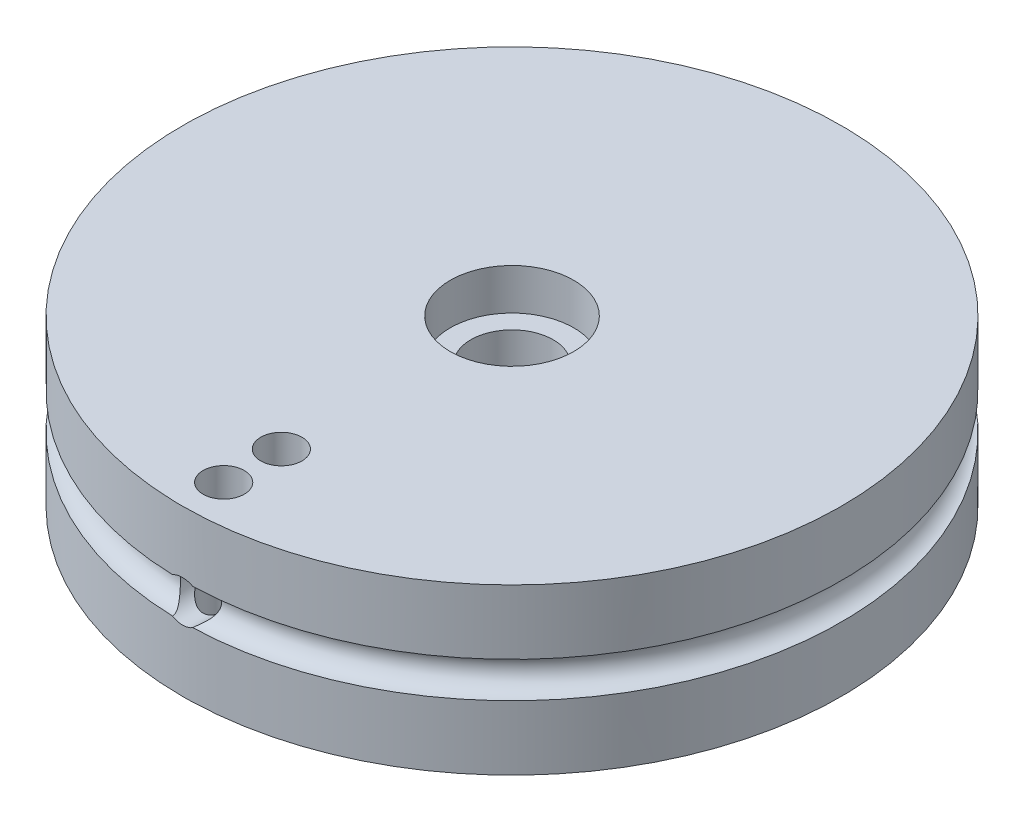
ISO-10303-21;
HEADER;
FILE_DESCRIPTION(('STEP AP214'),'2;1');
FILE_NAME('part.step','',(''),(''),'','','');
FILE_SCHEMA(('AUTOMOTIVE_DESIGN { 1 0 10303 214 1 1 1 1 }'));
ENDSEC;
DATA;
#1=APPLICATION_CONTEXT('core data for automotive mechanical design processes');
#2=APPLICATION_PROTOCOL_DEFINITION('international standard','automotive_design',2000,#1);
#3=PRODUCT_CONTEXT('',#1,'mechanical');
#4=PRODUCT('Part','Part','',(#3));
#5=PRODUCT_RELATED_PRODUCT_CATEGORY('part','',(#4));
#6=PRODUCT_DEFINITION_FORMATION('','',#4);
#7=PRODUCT_DEFINITION_CONTEXT('part definition',#1,'design');
#8=PRODUCT_DEFINITION('design','',#6,#7);
#9=PRODUCT_DEFINITION_SHAPE('','',#8);
#10=(LENGTH_UNIT() NAMED_UNIT(*) SI_UNIT(.MILLI.,.METRE.));
#11=(NAMED_UNIT(*) PLANE_ANGLE_UNIT() SI_UNIT($,.RADIAN.));
#12=(NAMED_UNIT(*) SI_UNIT($,.STERADIAN.) SOLID_ANGLE_UNIT());
#13=UNCERTAINTY_MEASURE_WITH_UNIT(LENGTH_MEASURE(1.E-05),#10,'distance_accuracy_value','');
#14=(GEOMETRIC_REPRESENTATION_CONTEXT(3) GLOBAL_UNCERTAINTY_ASSIGNED_CONTEXT((#13)) GLOBAL_UNIT_ASSIGNED_CONTEXT((#10,
#11,#12)) REPRESENTATION_CONTEXT('',''));
#15=CARTESIAN_POINT('',(0.,0.,0.));
#16=DIRECTION('',(0.,0.,1.));
#17=DIRECTION('',(1.,0.,0.));
#18=AXIS2_PLACEMENT_3D('',#15,#16,#17);
#19=CARTESIAN_POINT('',(0.,0.,7.112));
#20=DIRECTION('',(0.,1.,0.));
#21=DIRECTION('',(0.,0.,1.));
#22=AXIS2_PLACEMENT_3D('',#19,#20,#21);
#23=CYLINDRICAL_SURFACE('',#22,0.635);
#24=CARTESIAN_POINT('',(0.,0.,7.112));
#25=DIRECTION('',(0.,1.,0.));
#26=DIRECTION('',(0.,0.,1.));
#27=AXIS2_PLACEMENT_3D('',#24,#25,#26);
#28=CIRCLE('',#27,0.635);
#29=CARTESIAN_POINT('',(0.,0.,7.747));
#30=VERTEX_POINT('',#29);
#31=EDGE_CURVE('E176',#30,#30,#28,.T.);
#32=ORIENTED_EDGE('',*,*,#31,.F.);
#33=EDGE_LOOP('',(#32));
#34=FACE_BOUND('',#33,.T.);
#35=CARTESIAN_POINT('',(0.,2.54,7.112));
#36=DIRECTION('',(0.,0.707106781186547,0.707106781186547));
#37=DIRECTION('',(0.,0.707106781186547,-0.707106781186547));
#38=AXIS2_PLACEMENT_3D('',#35,#36,#37);
#39=ELLIPSE('',#38,0.898025612106916,0.635);
#40=CARTESIAN_POINT('',(-0.635,2.54,7.112));
#41=VERTEX_POINT('',#40);
#42=CARTESIAN_POINT('',(0.635,2.54,7.112));
#43=VERTEX_POINT('',#42);
#44=EDGE_CURVE('E116',#41,#43,#39,.T.);
#45=ORIENTED_EDGE('',*,*,#44,.T.);
#46=CARTESIAN_POINT('',(0.,2.54,7.112));
#47=DIRECTION('',(0.,0.707106781186547,-0.707106781186547));
#48=DIRECTION('',(0.,0.707106781186547,0.707106781186547));
#49=AXIS2_PLACEMENT_3D('',#46,#47,#48);
#50=ELLIPSE('',#49,0.898025612106916,0.635);
#51=CARTESIAN_POINT('',(0.,1.905,6.477));
#52=VERTEX_POINT('',#51);
#53=EDGE_CURVE('E95',#43,#52,#50,.T.);
#54=ORIENTED_EDGE('',*,*,#53,.T.);
#55=EDGE_CURVE('E111',#52,#41,#50,.T.);
#56=ORIENTED_EDGE('',*,*,#55,.T.);
#57=EDGE_LOOP('',(#45,#54,#56));
#58=FACE_BOUND('',#57,.T.);
#59=ADVANCED_FACE('F39',(#34,#58),#23,.F.);
#60=CARTESIAN_POINT('',(0.,0.,8.89));
#61=DIRECTION('',(0.,1.,0.));
#62=DIRECTION('',(0.,0.,1.));
#63=AXIS2_PLACEMENT_3D('',#60,#61,#62);
#64=CYLINDRICAL_SURFACE('',#63,0.635);
#65=CARTESIAN_POINT('',(0.,5.08,8.89));
#66=DIRECTION('',(0.,1.,0.));
#67=DIRECTION('',(0.,0.,1.));
#68=AXIS2_PLACEMENT_3D('',#65,#66,#67);
#69=CIRCLE('',#68,0.635);
#70=CARTESIAN_POINT('',(0.,5.08,9.525));
#71=VERTEX_POINT('',#70);
#72=EDGE_CURVE('E172',#71,#71,#69,.T.);
#73=ORIENTED_EDGE('',*,*,#72,.T.);
#74=EDGE_LOOP('',(#73));
#75=FACE_BOUND('',#74,.T.);
#76=CARTESIAN_POINT('',(0.,2.54,8.89));
#77=DIRECTION('',(0.,0.707106781186547,-0.707106781186547));
#78=DIRECTION('',(0.,0.707106781186547,0.707106781186547));
#79=AXIS2_PLACEMENT_3D('',#76,#77,#78);
#80=ELLIPSE('',#79,0.898025612106915,0.635);
#81=CARTESIAN_POINT('',(0.635,2.54,8.89));
#82=VERTEX_POINT('',#81);
#83=CARTESIAN_POINT('',(-0.635,2.54,8.89));
#84=VERTEX_POINT('',#83);
#85=EDGE_CURVE('E62',#82,#84,#80,.F.);
#86=ORIENTED_EDGE('',*,*,#85,.T.);
#87=CARTESIAN_POINT('',(0.,2.54,8.89));
#88=DIRECTION('',(0.,0.707106781186547,0.707106781186547));
#89=DIRECTION('',(0.,0.707106781186547,-0.707106781186547));
#90=AXIS2_PLACEMENT_3D('',#87,#88,#89);
#91=ELLIPSE('',#90,0.898025612106915,0.635);
#92=EDGE_CURVE('E11',#84,#82,#91,.F.);
#93=ORIENTED_EDGE('',*,*,#92,.T.);
#94=EDGE_LOOP('',(#86,#93));
#95=FACE_BOUND('',#94,.T.);
#96=ADVANCED_FACE('F235',(#75,#95),#64,.F.);
#97=CARTESIAN_POINT('',(0.,5.08,0.));
#98=DIRECTION('',(0.,-1.,0.));
#99=DIRECTION('',(0.,0.,-1.));
#100=AXIS2_PLACEMENT_3D('',#97,#98,#99);
#101=CYLINDRICAL_SURFACE('',#100,10.16);
#102=CARTESIAN_POINT('',(0.,5.08,0.));
#103=DIRECTION('',(0.,1.,0.));
#104=DIRECTION('',(0.,0.,1.));
#105=AXIS2_PLACEMENT_3D('',#102,#103,#104);
#106=CIRCLE('',#105,10.16);
#107=CARTESIAN_POINT('',(0.,5.08,10.16));
#108=VERTEX_POINT('',#107);
#109=EDGE_CURVE('E206',#108,#108,#106,.T.);
#110=ORIENTED_EDGE('',*,*,#109,.F.);
#111=EDGE_LOOP('',(#110));
#112=FACE_BOUND('',#111,.T.);
#113=CARTESIAN_POINT('',(0.,3.09207551870513,0.));
#114=DIRECTION('',(0.,-1.,0.));
#115=DIRECTION('',(0.,0.,-1.));
#116=AXIS2_PLACEMENT_3D('',#113,#114,#115);
#117=CIRCLE('',#116,10.16);
#118=CARTESIAN_POINT('',(-0.313747703810656,3.09207551870513,10.1551544733871));
#119=VERTEX_POINT('',#118);
#120=CARTESIAN_POINT('',(0.313747703810657,3.09207551870513,10.1551544733871));
#121=VERTEX_POINT('',#120);
#122=EDGE_CURVE('E192',#119,#121,#117,.T.);
#123=ORIENTED_EDGE('',*,*,#122,.F.);
#124=CARTESIAN_POINT('',(-0.313747703810656,3.09207551870513,10.1551544733871));
#125=CARTESIAN_POINT('',(-0.282734760763915,3.10973495539994,10.1561187171025));
#126=CARTESIAN_POINT('',(-0.250210890653607,3.12472516512716,10.1569756470182));
#127=CARTESIAN_POINT('',(-0.183168234973303,3.14904305910276,10.1584023386077));
#128=CARTESIAN_POINT('',(-0.148653028456574,3.1583805758584,10.158972598631));
#129=CARTESIAN_POINT('',(-0.0785099041731033,3.17113813427484,10.1597576032064));
#130=CARTESIAN_POINT('',(-0.042881066173587,3.17455314290737,10.1599720453729));
#131=CARTESIAN_POINT('',(0.0284486079471878,3.17536484827244,10.1600228292453));
#132=CARTESIAN_POINT('',(0.0641494541142928,3.17276063748849,10.1598591139364));
#133=CARTESIAN_POINT('',(0.136930142117497,3.16122182367551,10.1591460516877));
#134=CARTESIAN_POINT('',(0.173945960782989,3.15188161491191,10.1585720182667));
#135=CARTESIAN_POINT('',(0.24580412867807,3.12674674092526,10.1570921386118));
#136=CARTESIAN_POINT('',(0.280641281620536,3.11093727577585,10.1561855320352));
#137=CARTESIAN_POINT('',(0.313747703810656,3.09207551870513,10.1551544733871));
#138=B_SPLINE_CURVE_WITH_KNOTS('',3,(#124,#125,#126,#127,#128,#129,#130,#131,#132,#133,#134,
#135,#136,#137),.UNSPECIFIED.,.F.,.F.,(4,2,2,2,2,2,4),(0.,0.106963323552004,0.213740052427271,
0.320607477241476,0.427491015486438,0.541413581674679,0.655598242370814),.UNSPECIFIED.);
#139=EDGE_CURVE('E152',#119,#121,#138,.T.);
#140=ORIENTED_EDGE('',*,*,#139,.T.);
#141=EDGE_LOOP('',(#123,#140));
#142=FACE_BOUND('',#141,.T.);
#143=ADVANCED_FACE('F41',(#112,#142),#101,.T.);
#144=CARTESIAN_POINT('',(0.,0.,0.));
#145=DIRECTION('',(0.,1.,0.));
#146=DIRECTION('',(0.,0.,1.));
#147=AXIS2_PLACEMENT_3D('',#144,#145,#146);
#148=CIRCLE('',#147,10.16);
#149=CARTESIAN_POINT('',(0.,0.,10.16));
#150=VERTEX_POINT('',#149);
#151=EDGE_CURVE('E205',#150,#150,#148,.T.);
#152=ORIENTED_EDGE('',*,*,#151,.T.);
#153=EDGE_LOOP('',(#152));
#154=FACE_BOUND('',#153,.T.);
#155=CARTESIAN_POINT('',(0.,1.98792448129487,0.));
#156=DIRECTION('',(0.,1.,0.));
#157=DIRECTION('',(0.,0.,1.));
#158=AXIS2_PLACEMENT_3D('',#155,#156,#157);
#159=CIRCLE('',#158,10.16);
#160=CARTESIAN_POINT('',(0.313747703810656,1.98792448129487,10.1551544733871));
#161=VERTEX_POINT('',#160);
#162=CARTESIAN_POINT('',(-0.313747703810657,1.98792448129487,10.1551544733871));
#163=VERTEX_POINT('',#162);
#164=EDGE_CURVE('E171',#161,#163,#159,.T.);
#165=ORIENTED_EDGE('',*,*,#164,.F.);
#166=CARTESIAN_POINT('',(0.313747703810656,1.98792448129487,10.1551544733871));
#167=CARTESIAN_POINT('',(0.282734760763915,1.97026504460006,10.1561187171025));
#168=CARTESIAN_POINT('',(0.250210890653607,1.95527483487284,10.1569756470182));
#169=CARTESIAN_POINT('',(0.183168234973303,1.93095694089724,10.1584023386077));
#170=CARTESIAN_POINT('',(0.148653028456574,1.9216194241416,10.158972598631));
#171=CARTESIAN_POINT('',(0.0785099041731035,1.90886186572516,10.1597576032064));
#172=CARTESIAN_POINT('',(0.0428810661735871,1.90544685709263,10.1599720453729));
#173=CARTESIAN_POINT('',(-0.0284486079471877,1.90463515172756,10.1600228292453));
#174=CARTESIAN_POINT('',(-0.0641494541142927,1.90723936251151,10.1598591139364));
#175=CARTESIAN_POINT('',(-0.136930142117497,1.91877817632449,10.1591460516877));
#176=CARTESIAN_POINT('',(-0.173945960782989,1.92811838508809,10.1585720182667));
#177=CARTESIAN_POINT('',(-0.24580412867807,1.95325325907474,10.1570921386118));
#178=CARTESIAN_POINT('',(-0.280641281620536,1.96906272422415,10.1561855320352));
#179=CARTESIAN_POINT('',(-0.313747703810656,1.98792448129487,10.1551544733871));
#180=B_SPLINE_CURVE_WITH_KNOTS('',3,(#166,#167,#168,#169,#170,#171,#172,#173,#174,#175,#176,
#177,#178,#179),.UNSPECIFIED.,.F.,.F.,(4,2,2,2,2,2,4),(0.,0.106963323552004,0.213740052427271,
0.320607477241476,0.427491015486438,0.541413581674679,0.655598242370814),.UNSPECIFIED.);
#181=EDGE_CURVE('E130',#161,#163,#180,.T.);
#182=ORIENTED_EDGE('',*,*,#181,.T.);
#183=EDGE_LOOP('',(#165,#182));
#184=FACE_BOUND('',#183,.T.);
#185=ADVANCED_FACE('F242',(#154,#184),#101,.T.);
#186=CARTESIAN_POINT('',(0.,2.54,0.));
#187=DIRECTION('',(0.,1.,0.));
#188=DIRECTION('',(0.,0.,1.));
#189=AXIS2_PLACEMENT_3D('',#186,#187,#188);
#190=CYLINDRICAL_SURFACE('',#189,1.27);
#191=CARTESIAN_POINT('',(0.,2.54,0.));
#192=DIRECTION('',(0.,1.,0.));
#193=DIRECTION('',(0.,0.,1.));
#194=AXIS2_PLACEMENT_3D('',#191,#192,#193);
#195=CIRCLE('',#194,1.27);
#196=CARTESIAN_POINT('',(0.,2.54,1.27));
#197=VERTEX_POINT('',#196);
#198=EDGE_CURVE('E193',#197,#197,#195,.T.);
#199=ORIENTED_EDGE('',*,*,#198,.F.);
#200=EDGE_LOOP('',(#199));
#201=FACE_BOUND('',#200,.T.);
#202=CARTESIAN_POINT('',(0.,3.81,0.));
#203=DIRECTION('',(0.,1.,0.));
#204=DIRECTION('',(0.,0.,1.));
#205=AXIS2_PLACEMENT_3D('',#202,#203,#204);
#206=CIRCLE('',#205,1.27);
#207=CARTESIAN_POINT('',(0.,3.81,1.27));
#208=VERTEX_POINT('',#207);
#209=EDGE_CURVE('E187',#208,#208,#206,.F.);
#210=ORIENTED_EDGE('',*,*,#209,.F.);
#211=EDGE_LOOP('',(#210));
#212=FACE_BOUND('',#211,.T.);
#213=ADVANCED_FACE('F268',(#201,#212),#190,.F.);
#214=CARTESIAN_POINT('',(0.,5.08,0.));
#215=DIRECTION('',(0.,-1.,0.));
#216=DIRECTION('',(0.,0.,-1.));
#217=AXIS2_PLACEMENT_3D('',#214,#215,#216);
#218=CYLINDRICAL_SURFACE('',#217,2.38125);
#219=CARTESIAN_POINT('',(0.,0.,0.));
#220=DIRECTION('',(0.,1.,0.));
#221=DIRECTION('',(0.,0.,1.));
#222=AXIS2_PLACEMENT_3D('',#219,#220,#221);
#223=CIRCLE('',#222,2.38125);
#224=CARTESIAN_POINT('',(0.,0.,2.38125));
#225=VERTEX_POINT('',#224);
#226=EDGE_CURVE('E201',#225,#225,#223,.T.);
#227=ORIENTED_EDGE('',*,*,#226,.F.);
#228=EDGE_LOOP('',(#227));
#229=FACE_BOUND('',#228,.T.);
#230=CARTESIAN_POINT('',(0.,2.54,0.));
#231=DIRECTION('',(0.,1.,0.));
#232=DIRECTION('',(0.,0.,1.));
#233=AXIS2_PLACEMENT_3D('',#230,#231,#232);
#234=CIRCLE('',#233,2.38125);
#235=CARTESIAN_POINT('',(0.,2.54,2.38125));
#236=VERTEX_POINT('',#235);
#237=EDGE_CURVE('E197',#236,#236,#234,.T.);
#238=ORIENTED_EDGE('',*,*,#237,.T.);
#239=EDGE_LOOP('',(#238));
#240=FACE_BOUND('',#239,.T.);
#241=ADVANCED_FACE('F273',(#229,#240),#218,.F.);
#242=CARTESIAN_POINT('',(0.,5.08,0.));
#243=DIRECTION('',(0.,1.,0.));
#244=DIRECTION('',(0.,0.,1.));
#245=AXIS2_PLACEMENT_3D('',#242,#243,#244);
#246=PLANE('',#245);
#247=ORIENTED_EDGE('',*,*,#72,.F.);
#248=EDGE_LOOP('',(#247));
#249=FACE_BOUND('',#248,.T.);
#250=CARTESIAN_POINT('',(0.,5.08,7.112));
#251=DIRECTION('',(0.,1.,0.));
#252=DIRECTION('',(0.,0.,1.));
#253=AXIS2_PLACEMENT_3D('',#250,#251,#252);
#254=CIRCLE('',#253,0.635);
#255=CARTESIAN_POINT('',(0.,5.08,7.747));
#256=VERTEX_POINT('',#255);
#257=EDGE_CURVE('E166',#256,#256,#254,.T.);
#258=ORIENTED_EDGE('',*,*,#257,.F.);
#259=EDGE_LOOP('',(#258));
#260=FACE_BOUND('',#259,.T.);
#261=CARTESIAN_POINT('',(0.,5.08,0.));
#262=DIRECTION('',(0.,1.,0.));
#263=DIRECTION('',(0.,0.,1.));
#264=AXIS2_PLACEMENT_3D('',#261,#262,#263);
#265=CIRCLE('',#264,1.905);
#266=CARTESIAN_POINT('',(0.,5.08,1.905));
#267=VERTEX_POINT('',#266);
#268=EDGE_CURVE('E188',#267,#267,#265,.T.);
#269=ORIENTED_EDGE('',*,*,#268,.F.);
#270=EDGE_LOOP('',(#269));
#271=FACE_BOUND('',#270,.T.);
#272=ORIENTED_EDGE('',*,*,#109,.T.);
#273=EDGE_LOOP('',(#272));
#274=FACE_BOUND('',#273,.T.);
#275=ADVANCED_FACE('F282',(#249,#260,#271,#274),#246,.T.);
#276=CARTESIAN_POINT('',(0.,0.,0.));
#277=DIRECTION('',(0.,1.,0.));
#278=DIRECTION('',(0.,0.,1.));
#279=AXIS2_PLACEMENT_3D('',#276,#277,#278);
#280=PLANE('',#279);
#281=CARTESIAN_POINT('',(0.,0.,8.89));
#282=DIRECTION('',(0.,1.,0.));
#283=DIRECTION('',(0.,0.,1.));
#284=AXIS2_PLACEMENT_3D('',#281,#282,#283);
#285=CIRCLE('',#284,0.635);
#286=CARTESIAN_POINT('',(0.,0.,9.525));
#287=VERTEX_POINT('',#286);
#288=EDGE_CURVE('E167',#287,#287,#285,.T.);
#289=ORIENTED_EDGE('',*,*,#288,.T.);
#290=EDGE_LOOP('',(#289));
#291=FACE_BOUND('',#290,.T.);
#292=ORIENTED_EDGE('',*,*,#31,.T.);
#293=EDGE_LOOP('',(#292));
#294=FACE_BOUND('',#293,.T.);
#295=ORIENTED_EDGE('',*,*,#151,.F.);
#296=EDGE_LOOP('',(#295));
#297=FACE_BOUND('',#296,.T.);
#298=ORIENTED_EDGE('',*,*,#226,.T.);
#299=EDGE_LOOP('',(#298));
#300=FACE_BOUND('',#299,.T.);
#301=ADVANCED_FACE('F278',(#291,#294,#297,#300),#280,.F.);
#302=CARTESIAN_POINT('',(0.,2.54,0.));
#303=DIRECTION('',(0.,1.,0.));
#304=DIRECTION('',(0.,0.,1.));
#305=AXIS2_PLACEMENT_3D('',#302,#303,#304);
#306=PLANE('',#305);
#307=ORIENTED_EDGE('',*,*,#198,.T.);
#308=EDGE_LOOP('',(#307));
#309=FACE_BOUND('',#308,.T.);
#310=ORIENTED_EDGE('',*,*,#237,.F.);
#311=EDGE_LOOP('',(#310));
#312=FACE_BOUND('',#311,.T.);
#313=ADVANCED_FACE('F281',(#309,#312),#306,.F.);
#314=CARTESIAN_POINT('',(0.,3.81,0.));
#315=DIRECTION('',(0.,1.,0.));
#316=DIRECTION('',(0.,0.,1.));
#317=AXIS2_PLACEMENT_3D('',#314,#315,#316);
#318=PLANE('',#317);
#319=CARTESIAN_POINT('',(0.,3.81,0.));
#320=DIRECTION('',(0.,1.,0.));
#321=DIRECTION('',(0.,0.,1.));
#322=AXIS2_PLACEMENT_3D('',#319,#320,#321);
#323=CIRCLE('',#322,1.905);
#324=CARTESIAN_POINT('',(0.,3.81,1.905));
#325=VERTEX_POINT('',#324);
#326=EDGE_CURVE('E183',#325,#325,#323,.T.);
#327=ORIENTED_EDGE('',*,*,#326,.T.);
#328=EDGE_LOOP('',(#327));
#329=FACE_BOUND('',#328,.T.);
#330=ORIENTED_EDGE('',*,*,#209,.T.);
#331=EDGE_LOOP('',(#330));
#332=FACE_BOUND('',#331,.T.);
#333=ADVANCED_FACE('F257',(#329,#332),#318,.T.);
#334=CARTESIAN_POINT('',(0.,3.81,0.));
#335=DIRECTION('',(0.,1.,0.));
#336=DIRECTION('',(0.,0.,1.));
#337=AXIS2_PLACEMENT_3D('',#334,#335,#336);
#338=CYLINDRICAL_SURFACE('',#337,1.905);
#339=ORIENTED_EDGE('',*,*,#326,.F.);
#340=EDGE_LOOP('',(#339));
#341=FACE_BOUND('',#340,.T.);
#342=ORIENTED_EDGE('',*,*,#268,.T.);
#343=EDGE_LOOP('',(#342));
#344=FACE_BOUND('',#343,.T.);
#345=ADVANCED_FACE('F252',(#341,#344),#338,.F.);
#346=CARTESIAN_POINT('',(0.,2.54,0.));
#347=DIRECTION('',(0.,1.,0.));
#348=DIRECTION('',(0.,0.,1.));
#349=AXIS2_PLACEMENT_3D('',#346,#347,#348);
#350=TOROIDAL_SURFACE('',#349,10.16,0.552075518705132);
#351=CARTESIAN_POINT('',(0.313788252403684,1.98794752726444,10.1602));
#352=CARTESIAN_POINT('',(0.313416160819267,1.98776031914846,10.1418592720576));
#353=CARTESIAN_POINT('',(0.314809821017685,1.98852583070137,10.1236130140383));
#354=CARTESIAN_POINT('',(0.320354765680539,1.99171704730658,10.0880013249123));
#355=CARTESIAN_POINT('',(0.324457685787587,1.99411365742068,10.0706260951847));
#356=CARTESIAN_POINT('',(0.337030792007024,2.00175674999928,10.0290225475285));
#357=CARTESIAN_POINT('',(0.346640989180584,2.00780623428923,10.0053069250897));
#358=CARTESIAN_POINT('',(0.368161953692377,2.02245245373516,9.95956687251152));
#359=CARTESIAN_POINT('',(0.380095322773022,2.03107469785482,9.93756230036491));
#360=CARTESIAN_POINT('',(0.412552576240771,2.0566048437524,9.88218855932678));
#361=CARTESIAN_POINT('',(0.43385813532502,2.07535183583367,9.85012184153656));
#362=CARTESIAN_POINT('',(0.475995419261287,2.11860839686928,9.78996453307802));
#363=CARTESIAN_POINT('',(0.496828302411402,2.14310170683286,9.76186307566947));
#364=CARTESIAN_POINT('',(0.531032685009188,2.1909231639753,9.71693392714127));
#365=CARTESIAN_POINT('',(0.544935416495404,2.21289704852317,9.69907513612578));
#366=CARTESIAN_POINT('',(0.570635293686912,2.26014166839449,9.66645994508338));
#367=CARTESIAN_POINT('',(0.582435607405737,2.28540734231661,9.651698871209));
#368=CARTESIAN_POINT('',(0.600966135905038,2.33362267848392,9.62867770596983));
#369=CARTESIAN_POINT('',(0.608238482007031,2.35602211699548,9.61970764886156));
#370=CARTESIAN_POINT('',(0.620381170640194,2.40242889578798,9.60477896079417));
#371=CARTESIAN_POINT('',(0.62525320740041,2.4264350883276,9.59881820568229));
#372=CARTESIAN_POINT('',(0.632216609859363,2.47560516258657,9.59030923387693));
#373=CARTESIAN_POINT('',(0.634290992743453,2.50077516396525,9.5877818584262));
#374=CARTESIAN_POINT('',(0.635401520082146,2.5512798327436,9.58642803970692));
#375=CARTESIAN_POINT('',(0.634438501935646,2.57661445283672,9.58760057638795));
#376=CARTESIAN_POINT('',(0.629808502779165,2.62415401980358,9.59325103738749));
#377=CARTESIAN_POINT('',(0.626409640810232,2.64642613319938,9.59740124972009));
#378=CARTESIAN_POINT('',(0.617464808947986,2.68984784863121,9.60836203226362));
#379=CARTESIAN_POINT('',(0.611918055722452,2.71099703793526,9.61517357306458));
#380=CARTESIAN_POINT('',(0.596961536896693,2.75830505764938,9.63363618976795));
#381=CARTESIAN_POINT('',(0.586884333486062,2.78392052401758,9.64613729111128));
#382=CARTESIAN_POINT('',(0.564405868303551,2.83220528528623,9.67433517418501));
#383=CARTESIAN_POINT('',(0.552000137027906,2.85486876986427,9.69003810677435));
#384=CARTESIAN_POINT('',(0.521228285967349,2.90421112614792,9.72965142603756));
#385=CARTESIAN_POINT('',(0.502253877064883,2.92970985129327,9.75455276993877));
#386=CARTESIAN_POINT('',(0.463132403855374,2.9754745655205,9.80800652333662));
#387=CARTESIAN_POINT('',(0.44298356148377,2.9957323538184,9.83656455152356));
#388=CARTESIAN_POINT('',(0.408488000994682,3.02657386693283,9.88949437065949));
#389=CARTESIAN_POINT('',(0.39396594201412,3.03830806239259,9.91309056623504));
#390=CARTESIAN_POINT('',(0.366643534388678,3.05873335474366,9.9625049548377));
#391=CARTESIAN_POINT('',(0.353838785282004,3.06743232455708,9.9883171795561));
#392=CARTESIAN_POINT('',(0.336441089874325,3.07860534212608,10.0319866302446));
#393=CARTESIAN_POINT('',(0.330589266732741,3.08218519610864,10.0490471522639));
#394=CARTESIAN_POINT('',(0.321226001298661,3.08778583527255,10.0840163378095));
#395=CARTESIAN_POINT('',(0.317703979081362,3.08981367503788,10.1019207661242));
#396=CARTESIAN_POINT('',(0.314962534926824,3.09138382038933,10.1266829435211));
#397=CARTESIAN_POINT('',(0.314430773892635,3.09168695101212,10.1333612738853));
#398=CARTESIAN_POINT('',(0.313788576176942,3.0920523514893,10.1467601384169));
#399=CARTESIAN_POINT('',(0.313679120470366,3.0921140605491,10.1534807345686));
#400=CARTESIAN_POINT('',(0.313788252403684,3.09205247273556,10.1602));
#401=B_SPLINE_CURVE_WITH_KNOTS('',3,(#351,#352,#353,#354,#355,#356,#357,#358,#359,#360,#361,
#362,#363,#364,#365,#366,#367,#368,#369,#370,#371,#372,#373,#374,#375,#376,#377,#378,#379,#380,
#381,#382,#383,#384,#385,#386,#387,#388,#389,#390,#391,#392,#393,#394,#395,#396,#397,#398,#399,
#400),.UNSPECIFIED.,.F.,.F.,(4,2,2,2,2,2,2,2,2,2,2,2,2,2,2,2,2,2,2,2,2,2,2,2,4),(0.,
0.0547262000881997,0.108500949261183,0.186944305226952,0.266192845628888,0.394022329140895,
0.521494395555559,0.615807676198085,0.709977616925801,0.785279772710928,0.860528700967119,
0.936232393029734,1.01191521572224,1.08034130526305,1.1487923732186,1.23899253612985,
1.32936763829331,1.44987139116586,1.57056257779901,1.66063975579224,1.75048151910343,
1.8054842705086,1.86023550062275,1.8803392917209,1.90048975398791),.UNSPECIFIED.);
#402=EDGE_CURVE('E158',#161,#121,#401,.T.);
#403=ORIENTED_EDGE('',*,*,#402,.F.);
#404=ORIENTED_EDGE('',*,*,#164,.T.);
#405=CARTESIAN_POINT('',(-0.313788252403685,3.09205247273556,10.1602000000001));
#406=CARTESIAN_POINT('',(-0.313416160819263,3.09223968085154,10.1418592720578));
#407=CARTESIAN_POINT('',(-0.314809821017674,3.09147416929863,10.1236130140384));
#408=CARTESIAN_POINT('',(-0.320354765680513,3.08828295269343,10.0880013249125));
#409=CARTESIAN_POINT('',(-0.324457685787553,3.08588634257934,10.0706260951848));
#410=CARTESIAN_POINT('',(-0.337030792006969,3.07824325000075,10.0290225475286));
#411=CARTESIAN_POINT('',(-0.346640989180515,3.07219376571081,10.0053069250899));
#412=CARTESIAN_POINT('',(-0.36816195369228,3.0575475462649,9.9595668725117));
#413=CARTESIAN_POINT('',(-0.380095322772913,3.04892530214526,9.93756230036511));
#414=CARTESIAN_POINT('',(-0.412552576240641,3.02339515624771,9.88218855932698));
#415=CARTESIAN_POINT('',(-0.433858135324885,3.00464816416645,9.85012184153676));
#416=CARTESIAN_POINT('',(-0.475995419261147,2.96139160313088,9.78996453307822));
#417=CARTESIAN_POINT('',(-0.496828302411262,2.93689829316732,9.76186307566966));
#418=CARTESIAN_POINT('',(-0.531032685009062,2.8890768360249,9.71693392714143));
#419=CARTESIAN_POINT('',(-0.544935416495289,2.86710295147702,9.69907513612593));
#420=CARTESIAN_POINT('',(-0.57063529368682,2.8198583316057,9.6664599450835));
#421=CARTESIAN_POINT('',(-0.582435607405656,2.79459265768357,9.6516988712091));
#422=CARTESIAN_POINT('',(-0.600966135904975,2.74637732151627,9.62867770596991));
#423=CARTESIAN_POINT('',(-0.608238482006976,2.7239778830047,9.61970764886162));
#424=CARTESIAN_POINT('',(-0.620381170640154,2.6775711042122,9.60477896079422));
#425=CARTESIAN_POINT('',(-0.625253207400378,2.65356491167257,9.59881820568233));
#426=CARTESIAN_POINT('',(-0.632216609859345,2.6043948374136,9.59030923387695));
#427=CARTESIAN_POINT('',(-0.634290992743442,2.57922483603492,9.58778185842621));
#428=CARTESIAN_POINT('',(-0.635401520082149,2.52872016725656,9.58642803970692));
#429=CARTESIAN_POINT('',(-0.634438501935655,2.50338554716343,9.58760057638794));
#430=CARTESIAN_POINT('',(-0.629808502779184,2.45584598019656,9.59325103738747));
#431=CARTESIAN_POINT('',(-0.626409640810255,2.43357386680076,9.59740124972006));
#432=CARTESIAN_POINT('',(-0.617464808948019,2.39015215136893,9.60836203226358));
#433=CARTESIAN_POINT('',(-0.611918055722489,2.36900296206487,9.61517357306454));
#434=CARTESIAN_POINT('',(-0.596961536896741,2.32169494235075,9.6336361897679));
#435=CARTESIAN_POINT('',(-0.586884333486117,2.29607947598256,9.64613729111121));
#436=CARTESIAN_POINT('',(-0.564405868303619,2.24779471471391,9.67433517418493));
#437=CARTESIAN_POINT('',(-0.552000137027981,2.22513123013587,9.69003810677425));
#438=CARTESIAN_POINT('',(-0.521228285967439,2.17578887385221,9.72965142603744));
#439=CARTESIAN_POINT('',(-0.50225387706498,2.15029014870685,9.75455276993864));
#440=CARTESIAN_POINT('',(-0.463132403855485,2.10452543447962,9.80800652333646));
#441=CARTESIAN_POINT('',(-0.442983561483887,2.08426764618171,9.83656455152339));
#442=CARTESIAN_POINT('',(-0.408488000994785,2.05342613306725,9.88949437065933));
#443=CARTESIAN_POINT('',(-0.393965942014205,2.04169193760747,9.9130905662349));
#444=CARTESIAN_POINT('',(-0.366643534388728,2.02126664525637,9.9625049548376));
#445=CARTESIAN_POINT('',(-0.353838785282038,2.01256767544294,9.98831717955602));
#446=CARTESIAN_POINT('',(-0.336441089874343,2.00139465787393,10.0319866302445));
#447=CARTESIAN_POINT('',(-0.330589266732757,1.99781480389138,10.0490471522639));
#448=CARTESIAN_POINT('',(-0.321226001298673,1.99221416472745,10.0840163378095));
#449=CARTESIAN_POINT('',(-0.317703979081372,1.99018632496212,10.1019207661242));
#450=CARTESIAN_POINT('',(-0.314962534926826,1.98861617961067,10.1266829435211));
#451=CARTESIAN_POINT('',(-0.314430773892635,1.98831304898788,10.1333612738853));
#452=CARTESIAN_POINT('',(-0.31378857617694,1.9879476485107,10.1467601384169));
#453=CARTESIAN_POINT('',(-0.313679120470365,1.9878859394509,10.1534807345687));
#454=CARTESIAN_POINT('',(-0.313788252403685,1.98794752726444,10.1602000000001));
#455=B_SPLINE_CURVE_WITH_KNOTS('',3,(#405,#406,#407,#408,#409,#410,#411,#412,#413,#414,#415,
#416,#417,#418,#419,#420,#421,#422,#423,#424,#425,#426,#427,#428,#429,#430,#431,#432,#433,#434,
#435,#436,#437,#438,#439,#440,#441,#442,#443,#444,#445,#446,#447,#448,#449,#450,#451,#452,#453,
#454),.UNSPECIFIED.,.F.,.F.,(4,2,2,2,2,2,2,2,2,2,2,2,2,2,2,2,2,2,2,2,2,2,2,2,4),(0.,
0.0547262000881788,0.10850094926114,0.186944305226853,0.266192845628731,0.394022329140718,
0.521494395555366,0.615807676197935,0.709977616925693,0.785279772710834,0.860528700967042,
0.936232393029673,1.0119152157222,1.08034130526301,1.14879237321856,1.23899253612979,
1.32936763829322,1.44987139116574,1.57056257779887,1.66063975579219,1.75048151910348,
1.80548427050865,1.86023550062279,1.88033929172103,1.90048975398811),.UNSPECIFIED.);
#456=EDGE_CURVE('E98',#119,#163,#455,.T.);
#457=ORIENTED_EDGE('',*,*,#456,.F.);
#458=ORIENTED_EDGE('',*,*,#122,.T.);
#459=EDGE_LOOP('',(#403,#404,#457,#458));
#460=FACE_BOUND('',#459,.T.);
#461=ADVANCED_FACE('F136',(#460),#350,.F.);
#462=CARTESIAN_POINT('',(0.,2.54,7.112));
#463=DIRECTION('',(0.,0.707106781186547,0.707106781186547));
#464=DIRECTION('',(0.,0.707106781186547,-0.707106781186547));
#465=AXIS2_PLACEMENT_3D('',#462,#463,#464);
#466=ELLIPSE('',#465,0.898025612106916,0.635);
#467=CARTESIAN_POINT('',(0.,3.175,6.477));
#468=VERTEX_POINT('',#467);
#469=EDGE_CURVE('E89',#468,#43,#466,.F.);
#470=ORIENTED_EDGE('',*,*,#469,.T.);
#471=CARTESIAN_POINT('',(0.,2.54,7.112));
#472=DIRECTION('',(0.,0.707106781186547,-0.707106781186547));
#473=DIRECTION('',(0.,0.707106781186547,0.707106781186547));
#474=AXIS2_PLACEMENT_3D('',#471,#472,#473);
#475=ELLIPSE('',#474,0.898025612106916,0.635);
#476=EDGE_CURVE('E56',#43,#41,#475,.F.);
#477=ORIENTED_EDGE('',*,*,#476,.T.);
#478=EDGE_CURVE('E99',#41,#468,#466,.F.);
#479=ORIENTED_EDGE('',*,*,#478,.T.);
#480=EDGE_LOOP('',(#470,#477,#479));
#481=FACE_BOUND('',#480,.T.);
#482=ORIENTED_EDGE('',*,*,#257,.T.);
#483=EDGE_LOOP('',(#482));
#484=FACE_BOUND('',#483,.T.);
#485=ADVANCED_FACE('F113',(#481,#484),#23,.F.);
#486=CARTESIAN_POINT('',(0.,2.54,8.89));
#487=DIRECTION('',(0.,0.707106781186547,-0.707106781186547));
#488=DIRECTION('',(0.,0.707106781186547,0.707106781186547));
#489=AXIS2_PLACEMENT_3D('',#486,#487,#488);
#490=ELLIPSE('',#489,0.898025612106915,0.635);
#491=EDGE_CURVE('E224',#82,#84,#490,.T.);
#492=ORIENTED_EDGE('',*,*,#491,.T.);
#493=CARTESIAN_POINT('',(0.,2.54,8.89));
#494=DIRECTION('',(0.,0.707106781186547,0.707106781186547));
#495=DIRECTION('',(0.,0.707106781186547,-0.707106781186547));
#496=AXIS2_PLACEMENT_3D('',#493,#494,#495);
#497=ELLIPSE('',#496,0.898025612106915,0.635);
#498=EDGE_CURVE('E49',#84,#82,#497,.T.);
#499=ORIENTED_EDGE('',*,*,#498,.T.);
#500=EDGE_LOOP('',(#492,#499));
#501=FACE_BOUND('',#500,.T.);
#502=ORIENTED_EDGE('',*,*,#288,.F.);
#503=EDGE_LOOP('',(#502));
#504=FACE_BOUND('',#503,.T.);
#505=ADVANCED_FACE('F146',(#501,#504),#64,.F.);
#506=CARTESIAN_POINT('',(0.,2.54,6.477));
#507=DIRECTION('',(0.,0.,1.));
#508=DIRECTION('',(1.,0.,0.));
#509=AXIS2_PLACEMENT_3D('',#506,#507,#508);
#510=CYLINDRICAL_SURFACE('',#509,0.635);
#511=ORIENTED_EDGE('',*,*,#85,.F.);
#512=ORIENTED_EDGE('',*,*,#498,.F.);
#513=EDGE_LOOP('',(#511,#512));
#514=FACE_BOUND('',#513,.T.);
#515=ORIENTED_EDGE('',*,*,#139,.F.);
#516=ORIENTED_EDGE('',*,*,#456,.T.);
#517=ORIENTED_EDGE('',*,*,#181,.F.);
#518=ORIENTED_EDGE('',*,*,#402,.T.);
#519=EDGE_LOOP('',(#515,#516,#517,#518));
#520=FACE_BOUND('',#519,.T.);
#521=ADVANCED_FACE('F140',(#514,#520),#510,.F.);
#522=ORIENTED_EDGE('',*,*,#491,.F.);
#523=ORIENTED_EDGE('',*,*,#92,.F.);
#524=EDGE_LOOP('',(#522,#523));
#525=FACE_BOUND('',#524,.T.);
#526=ORIENTED_EDGE('',*,*,#476,.F.);
#527=ORIENTED_EDGE('',*,*,#44,.F.);
#528=EDGE_LOOP('',(#526,#527));
#529=FACE_BOUND('',#528,.T.);
#530=ADVANCED_FACE('F145',(#525,#529),#510,.F.);
#531=CARTESIAN_POINT('',(0.,2.54,6.477));
#532=DIRECTION('',(0.,0.,1.));
#533=DIRECTION('',(1.,0.,0.));
#534=AXIS2_PLACEMENT_3D('',#531,#532,#533);
#535=PLANE('',#534);
#536=CARTESIAN_POINT('',(0.,2.54,6.477));
#537=DIRECTION('',(0.,0.,1.));
#538=DIRECTION('',(1.,0.,0.));
#539=AXIS2_PLACEMENT_3D('',#536,#537,#538);
#540=CIRCLE('',#539,0.635);
#541=EDGE_CURVE('E92',#52,#468,#540,.T.);
#542=ORIENTED_EDGE('',*,*,#541,.T.);
#543=EDGE_CURVE('E104',#468,#52,#540,.T.);
#544=ORIENTED_EDGE('',*,*,#543,.T.);
#545=EDGE_LOOP('',(#542,#544));
#546=FACE_BOUND('',#545,.T.);
#547=ADVANCED_FACE('F103',(#546),#535,.T.);
#548=ORIENTED_EDGE('',*,*,#541,.F.);
#549=ORIENTED_EDGE('',*,*,#53,.F.);
#550=ORIENTED_EDGE('',*,*,#469,.F.);
#551=EDGE_LOOP('',(#548,#549,#550));
#552=FACE_BOUND('',#551,.T.);
#553=ADVANCED_FACE('F91',(#552),#510,.F.);
#554=ORIENTED_EDGE('',*,*,#55,.F.);
#555=ORIENTED_EDGE('',*,*,#543,.F.);
#556=ORIENTED_EDGE('',*,*,#478,.F.);
#557=EDGE_LOOP('',(#554,#555,#556));
#558=FACE_BOUND('',#557,.T.);
#559=ADVANCED_FACE('F109',(#558),#510,.F.);
#560=CLOSED_SHELL('',(#59,#96,#143,#185,#213,#241,#275,#301,#313,#333,#345,#461,#485,#505,#521,
#530,#547,#553,#559));
#561=MANIFOLD_SOLID_BREP('B2',#560);
#562=ADVANCED_BREP_SHAPE_REPRESENTATION('',(#18,#561),#14);
#563=SHAPE_DEFINITION_REPRESENTATION(#9,#562);
ENDSEC;
END-ISO-10303-21;
